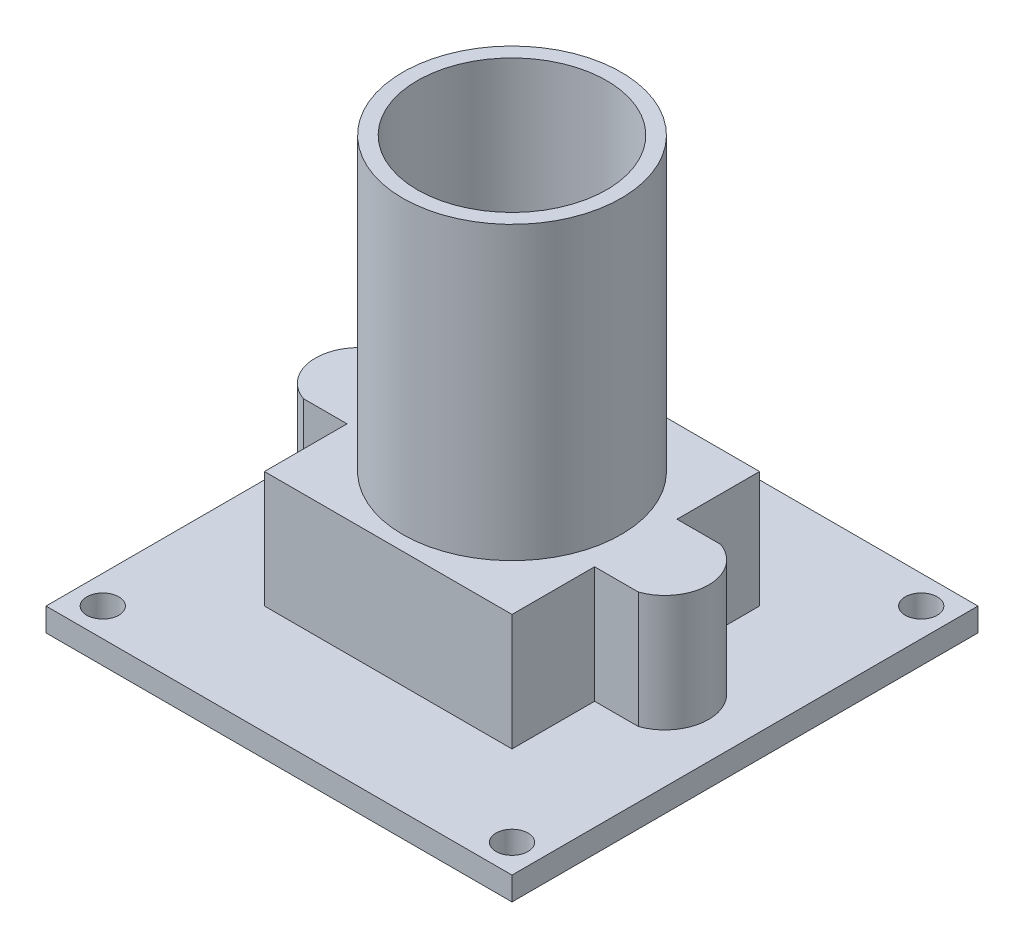
ISO-10303-21;
HEADER;
FILE_DESCRIPTION(('STEP AP214'),'2;1');
FILE_NAME('part.step','',(''),(''),'','','');
FILE_SCHEMA(('AUTOMOTIVE_DESIGN { 1 0 10303 214 1 1 1 1 }'));
ENDSEC;
DATA;
#1=APPLICATION_CONTEXT('core data for automotive mechanical design processes');
#2=APPLICATION_PROTOCOL_DEFINITION('international standard','automotive_design',2000,#1);
#3=PRODUCT_CONTEXT('',#1,'mechanical');
#4=PRODUCT('Part','Part','',(#3));
#5=PRODUCT_RELATED_PRODUCT_CATEGORY('part','',(#4));
#6=PRODUCT_DEFINITION_FORMATION('','',#4);
#7=PRODUCT_DEFINITION_CONTEXT('part definition',#1,'design');
#8=PRODUCT_DEFINITION('design','',#6,#7);
#9=PRODUCT_DEFINITION_SHAPE('','',#8);
#10=(LENGTH_UNIT() NAMED_UNIT(*) SI_UNIT(.MILLI.,.METRE.));
#11=(NAMED_UNIT(*) PLANE_ANGLE_UNIT() SI_UNIT($,.RADIAN.));
#12=(NAMED_UNIT(*) SI_UNIT($,.STERADIAN.) SOLID_ANGLE_UNIT());
#13=UNCERTAINTY_MEASURE_WITH_UNIT(LENGTH_MEASURE(1.E-05),#10,'distance_accuracy_value','');
#14=(GEOMETRIC_REPRESENTATION_CONTEXT(3) GLOBAL_UNCERTAINTY_ASSIGNED_CONTEXT((#13)) GLOBAL_UNIT_ASSIGNED_CONTEXT((#10,
#11,#12)) REPRESENTATION_CONTEXT('',''));
#15=CARTESIAN_POINT('',(0.,0.,0.));
#16=DIRECTION('',(0.,0.,1.));
#17=DIRECTION('',(1.,0.,0.));
#18=AXIS2_PLACEMENT_3D('',#15,#16,#17);
#19=CARTESIAN_POINT('',(0.,1.6,0.));
#20=DIRECTION('',(0.,-1.,0.));
#21=DIRECTION('',(0.,0.,-1.));
#22=AXIS2_PLACEMENT_3D('',#19,#20,#21);
#23=PLANE('',#22);
#24=CARTESIAN_POINT('',(-30.0499990738238,1.6,-1.95000092617623));
#25=DIRECTION('',(0.,1.,0.));
#26=DIRECTION('',(0.,0.,1.));
#27=AXIS2_PLACEMENT_3D('',#24,#25,#26);
#28=CIRCLE('',#27,1.1);
#29=CARTESIAN_POINT('',(-30.0499990738238,1.6,-0.850000926176233));
#30=VERTEX_POINT('',#29);
#31=EDGE_CURVE('E326',#30,#30,#28,.T.);
#32=ORIENTED_EDGE('',*,*,#31,.F.);
#33=EDGE_LOOP('',(#32));
#34=FACE_BOUND('',#33,.T.);
#35=CARTESIAN_POINT('',(-1.94999907382376,1.6,-1.94999907382376));
#36=DIRECTION('',(0.,1.,0.));
#37=DIRECTION('',(0.,0.,1.));
#38=AXIS2_PLACEMENT_3D('',#35,#36,#37);
#39=CIRCLE('',#38,1.1);
#40=CARTESIAN_POINT('',(-1.94999907382376,1.6,-0.849999073823763));
#41=VERTEX_POINT('',#40);
#42=EDGE_CURVE('E332',#41,#41,#39,.T.);
#43=ORIENTED_EDGE('',*,*,#42,.F.);
#44=EDGE_LOOP('',(#43));
#45=FACE_BOUND('',#44,.T.);
#46=CARTESIAN_POINT('',(-1.95000092617624,1.6,-30.0499990738238));
#47=DIRECTION('',(0.,1.,0.));
#48=DIRECTION('',(0.,0.,1.));
#49=AXIS2_PLACEMENT_3D('',#46,#47,#48);
#50=CIRCLE('',#49,1.1);
#51=CARTESIAN_POINT('',(-1.95000092617624,1.6,-28.9499990738238));
#52=VERTEX_POINT('',#51);
#53=EDGE_CURVE('E338',#52,#52,#50,.T.);
#54=ORIENTED_EDGE('',*,*,#53,.F.);
#55=EDGE_LOOP('',(#54));
#56=FACE_BOUND('',#55,.T.);
#57=CARTESIAN_POINT('',(-30.0500009261762,1.6,-30.0500009261762));
#58=DIRECTION('',(0.,1.,0.));
#59=DIRECTION('',(0.,0.,1.));
#60=AXIS2_PLACEMENT_3D('',#57,#58,#59);
#61=CIRCLE('',#60,1.1);
#62=CARTESIAN_POINT('',(-30.0500009261762,1.6,-28.9500009261762));
#63=VERTEX_POINT('',#62);
#64=EDGE_CURVE('E320',#63,#63,#61,.T.);
#65=ORIENTED_EDGE('',*,*,#64,.F.);
#66=EDGE_LOOP('',(#65));
#67=FACE_BOUND('',#66,.T.);
#68=DIRECTION('',(0.,0.,-1.));
#69=VECTOR('',#68,1.);
#70=CARTESIAN_POINT('',(0.,1.6,-32.));
#71=LINE('',#70,#69);
#72=CARTESIAN_POINT('',(0.,1.6,0.));
#73=VERTEX_POINT('',#72);
#74=CARTESIAN_POINT('',(0.,1.6,-32.));
#75=VERTEX_POINT('',#74);
#76=EDGE_CURVE('E210',#73,#75,#71,.T.);
#77=ORIENTED_EDGE('',*,*,#76,.T.);
#78=DIRECTION('',(-1.,0.,0.));
#79=VECTOR('',#78,1.);
#80=CARTESIAN_POINT('',(-32.,1.6,-32.));
#81=LINE('',#80,#79);
#82=CARTESIAN_POINT('',(-32.,1.6,-32.));
#83=VERTEX_POINT('',#82);
#84=EDGE_CURVE('E213',#75,#83,#81,.T.);
#85=ORIENTED_EDGE('',*,*,#84,.T.);
#86=DIRECTION('',(0.,0.,1.));
#87=VECTOR('',#86,1.);
#88=CARTESIAN_POINT('',(-32.,1.6,0.));
#89=LINE('',#88,#87);
#90=CARTESIAN_POINT('',(-32.,1.6,0.));
#91=VERTEX_POINT('',#90);
#92=EDGE_CURVE('E216',#83,#91,#89,.T.);
#93=ORIENTED_EDGE('',*,*,#92,.T.);
#94=DIRECTION('',(1.,0.,0.));
#95=VECTOR('',#94,1.);
#96=CARTESIAN_POINT('',(0.,1.6,0.));
#97=LINE('',#96,#95);
#98=EDGE_CURVE('E218',#91,#73,#97,.T.);
#99=ORIENTED_EDGE('',*,*,#98,.T.);
#100=EDGE_LOOP('',(#77,#85,#93,#99));
#101=FACE_BOUND('',#100,.T.);
#102=DIRECTION('',(1.,0.,0.));
#103=VECTOR('',#102,1.);
#104=CARTESIAN_POINT('',(-4.5,1.6,-13.1715728752538));
#105=LINE('',#104,#103);
#106=CARTESIAN_POINT('',(-7.5,1.6,-13.1715728752538));
#107=VERTEX_POINT('',#106);
#108=CARTESIAN_POINT('',(-4.5,1.6,-13.1715728752538));
#109=VERTEX_POINT('',#108);
#110=EDGE_CURVE('E260',#107,#109,#105,.T.);
#111=ORIENTED_EDGE('',*,*,#110,.F.);
#112=DIRECTION('',(0.,0.,-1.));
#113=VECTOR('',#112,1.);
#114=CARTESIAN_POINT('',(-7.5,1.6,-7.5));
#115=LINE('',#114,#113);
#116=CARTESIAN_POINT('',(-7.5,1.6,-7.5));
#117=VERTEX_POINT('',#116);
#118=EDGE_CURVE('E168',#117,#107,#115,.T.);
#119=ORIENTED_EDGE('',*,*,#118,.F.);
#120=DIRECTION('',(1.,0.,0.));
#121=VECTOR('',#120,1.);
#122=CARTESIAN_POINT('',(-24.5,1.6,-7.5));
#123=LINE('',#122,#121);
#124=CARTESIAN_POINT('',(-24.5,1.6,-7.5));
#125=VERTEX_POINT('',#124);
#126=EDGE_CURVE('E180',#125,#117,#123,.T.);
#127=ORIENTED_EDGE('',*,*,#126,.F.);
#128=DIRECTION('',(0.,0.,1.));
#129=VECTOR('',#128,1.);
#130=CARTESIAN_POINT('',(-24.5,1.6,-24.5));
#131=LINE('',#130,#129);
#132=CARTESIAN_POINT('',(-24.5,1.6,-13.1715728752538));
#133=VERTEX_POINT('',#132);
#134=EDGE_CURVE('E193',#133,#125,#131,.T.);
#135=ORIENTED_EDGE('',*,*,#134,.F.);
#136=DIRECTION('',(1.,0.,0.));
#137=VECTOR('',#136,1.);
#138=CARTESIAN_POINT('',(-27.5,1.6,-13.1715728752538));
#139=LINE('',#138,#137);
#140=CARTESIAN_POINT('',(-27.5,1.6,-13.1715728752538));
#141=VERTEX_POINT('',#140);
#142=EDGE_CURVE('E283',#141,#133,#139,.T.);
#143=ORIENTED_EDGE('',*,*,#142,.F.);
#144=CARTESIAN_POINT('',(-26.5,1.6,-16.));
#145=DIRECTION('',(0.,1.,0.));
#146=DIRECTION('',(0.,0.,1.));
#147=AXIS2_PLACEMENT_3D('',#144,#145,#146);
#148=CIRCLE('',#147,3.);
#149=CARTESIAN_POINT('',(-27.5,1.6,-18.8284271247462));
#150=VERTEX_POINT('',#149);
#151=EDGE_CURVE('E288',#150,#141,#148,.T.);
#152=ORIENTED_EDGE('',*,*,#151,.F.);
#153=DIRECTION('',(-1.,0.,0.));
#154=VECTOR('',#153,1.);
#155=CARTESIAN_POINT('',(-24.5,1.6,-18.8284271247462));
#156=LINE('',#155,#154);
#157=CARTESIAN_POINT('',(-24.5,1.6,-18.8284271247462));
#158=VERTEX_POINT('',#157);
#159=EDGE_CURVE('E169',#158,#150,#156,.T.);
#160=ORIENTED_EDGE('',*,*,#159,.F.);
#161=CARTESIAN_POINT('',(-24.5,1.6,-24.5));
#162=VERTEX_POINT('',#161);
#163=EDGE_CURVE('E194',#162,#158,#131,.T.);
#164=ORIENTED_EDGE('',*,*,#163,.F.);
#165=DIRECTION('',(-1.,0.,0.));
#166=VECTOR('',#165,1.);
#167=CARTESIAN_POINT('',(-7.5,1.6,-24.5));
#168=LINE('',#167,#166);
#169=CARTESIAN_POINT('',(-7.5,1.6,-24.5));
#170=VERTEX_POINT('',#169);
#171=EDGE_CURVE('E189',#170,#162,#168,.T.);
#172=ORIENTED_EDGE('',*,*,#171,.F.);
#173=CARTESIAN_POINT('',(-7.5,1.6,-18.8284271247462));
#174=VERTEX_POINT('',#173);
#175=EDGE_CURVE('E190',#174,#170,#115,.T.);
#176=ORIENTED_EDGE('',*,*,#175,.F.);
#177=DIRECTION('',(-1.,0.,0.));
#178=VECTOR('',#177,1.);
#179=CARTESIAN_POINT('',(-7.5,1.6,-18.8284271247462));
#180=LINE('',#179,#178);
#181=CARTESIAN_POINT('',(-4.5,1.6,-18.8284271247462));
#182=VERTEX_POINT('',#181);
#183=EDGE_CURVE('E160',#182,#174,#180,.T.);
#184=ORIENTED_EDGE('',*,*,#183,.F.);
#185=CARTESIAN_POINT('',(-5.49999999999999,1.6,-16.));
#186=DIRECTION('',(0.,1.,0.));
#187=DIRECTION('',(0.,0.,-1.));
#188=AXIS2_PLACEMENT_3D('',#185,#186,#187);
#189=CIRCLE('',#188,3.);
#190=EDGE_CURVE('E263',#109,#182,#189,.T.);
#191=ORIENTED_EDGE('',*,*,#190,.F.);
#192=EDGE_LOOP('',(#111,#119,#127,#135,#143,#152,#160,#164,#172,#176,#184,#191));
#193=FACE_BOUND('',#192,.T.);
#194=ADVANCED_FACE('F34',(#34,#45,#56,#67,#101,#193),#23,.F.);
#195=CARTESIAN_POINT('',(-7.5,9.6,-7.5));
#196=DIRECTION('',(-1.,0.,0.));
#197=DIRECTION('',(0.,0.,1.));
#198=AXIS2_PLACEMENT_3D('',#195,#196,#197);
#199=PLANE('',#198);
#200=DIRECTION('',(0.,-1.,0.));
#201=VECTOR('',#200,1.);
#202=CARTESIAN_POINT('',(-7.5,9.6,-13.1715728752538));
#203=LINE('',#202,#201);
#204=CARTESIAN_POINT('',(-7.5,9.6,-13.1715728752538));
#205=VERTEX_POINT('',#204);
#206=EDGE_CURVE('E152',#205,#107,#203,.T.);
#207=ORIENTED_EDGE('',*,*,#206,.F.);
#208=DIRECTION('',(0.,0.,-1.));
#209=VECTOR('',#208,1.);
#210=CARTESIAN_POINT('',(-7.5,9.6,-7.5));
#211=LINE('',#210,#209);
#212=CARTESIAN_POINT('',(-7.5,9.6,-7.5));
#213=VERTEX_POINT('',#212);
#214=EDGE_CURVE('E167',#213,#205,#211,.T.);
#215=ORIENTED_EDGE('',*,*,#214,.F.);
#216=DIRECTION('',(0.,-1.,0.));
#217=VECTOR('',#216,1.);
#218=CARTESIAN_POINT('',(-7.5,9.6,-7.5));
#219=LINE('',#218,#217);
#220=EDGE_CURVE('E187',#213,#117,#219,.T.);
#221=ORIENTED_EDGE('',*,*,#220,.T.);
#222=ORIENTED_EDGE('',*,*,#118,.T.);
#223=EDGE_LOOP('',(#207,#215,#221,#222));
#224=FACE_BOUND('',#223,.T.);
#225=ADVANCED_FACE('F165',(#224),#199,.F.);
#226=DIRECTION('',(0.,-1.,0.));
#227=VECTOR('',#226,1.);
#228=CARTESIAN_POINT('',(-7.5,9.6,-18.8284271247462));
#229=LINE('',#228,#227);
#230=CARTESIAN_POINT('',(-7.5,9.6,-18.8284271247462));
#231=VERTEX_POINT('',#230);
#232=EDGE_CURVE('E50',#231,#174,#229,.T.);
#233=ORIENTED_EDGE('',*,*,#232,.T.);
#234=ORIENTED_EDGE('',*,*,#175,.T.);
#235=DIRECTION('',(0.,-1.,0.));
#236=VECTOR('',#235,1.);
#237=CARTESIAN_POINT('',(-7.5,9.6,-24.5));
#238=LINE('',#237,#236);
#239=CARTESIAN_POINT('',(-7.5,9.6,-24.5));
#240=VERTEX_POINT('',#239);
#241=EDGE_CURVE('E206',#240,#170,#238,.T.);
#242=ORIENTED_EDGE('',*,*,#241,.F.);
#243=EDGE_CURVE('E176',#231,#240,#211,.T.);
#244=ORIENTED_EDGE('',*,*,#243,.F.);
#245=EDGE_LOOP('',(#233,#234,#242,#244));
#246=FACE_BOUND('',#245,.T.);
#247=ADVANCED_FACE('F307',(#246),#199,.F.);
#248=CARTESIAN_POINT('',(-24.5,9.6,-24.5));
#249=DIRECTION('',(1.,0.,0.));
#250=DIRECTION('',(0.,0.,-1.));
#251=AXIS2_PLACEMENT_3D('',#248,#249,#250);
#252=PLANE('',#251);
#253=DIRECTION('',(0.,-1.,0.));
#254=VECTOR('',#253,1.);
#255=CARTESIAN_POINT('',(-24.5,9.6,-18.8284271247462));
#256=LINE('',#255,#254);
#257=CARTESIAN_POINT('',(-24.5,9.6,-18.8284271247462));
#258=VERTEX_POINT('',#257);
#259=EDGE_CURVE('E298',#258,#158,#256,.T.);
#260=ORIENTED_EDGE('',*,*,#259,.F.);
#261=DIRECTION('',(0.,0.,1.));
#262=VECTOR('',#261,1.);
#263=CARTESIAN_POINT('',(-24.5,9.6,-24.5));
#264=LINE('',#263,#262);
#265=CARTESIAN_POINT('',(-24.5,9.6,-24.5));
#266=VERTEX_POINT('',#265);
#267=EDGE_CURVE('E183',#266,#258,#264,.T.);
#268=ORIENTED_EDGE('',*,*,#267,.F.);
#269=DIRECTION('',(0.,-1.,0.));
#270=VECTOR('',#269,1.);
#271=CARTESIAN_POINT('',(-24.5,9.6,-24.5));
#272=LINE('',#271,#270);
#273=EDGE_CURVE('E203',#266,#162,#272,.T.);
#274=ORIENTED_EDGE('',*,*,#273,.T.);
#275=ORIENTED_EDGE('',*,*,#163,.T.);
#276=EDGE_LOOP('',(#260,#268,#274,#275));
#277=FACE_BOUND('',#276,.T.);
#278=ADVANCED_FACE('F410',(#277),#252,.F.);
#279=DIRECTION('',(0.,-1.,0.));
#280=VECTOR('',#279,1.);
#281=CARTESIAN_POINT('',(-24.5,9.6,-13.1715728752538));
#282=LINE('',#281,#280);
#283=CARTESIAN_POINT('',(-24.5,9.6,-13.1715728752538));
#284=VERTEX_POINT('',#283);
#285=EDGE_CURVE('E58',#284,#133,#282,.T.);
#286=ORIENTED_EDGE('',*,*,#285,.T.);
#287=ORIENTED_EDGE('',*,*,#134,.T.);
#288=DIRECTION('',(0.,-1.,0.));
#289=VECTOR('',#288,1.);
#290=CARTESIAN_POINT('',(-24.5,9.6,-7.5));
#291=LINE('',#290,#289);
#292=CARTESIAN_POINT('',(-24.5,9.6,-7.5));
#293=VERTEX_POINT('',#292);
#294=EDGE_CURVE('E200',#293,#125,#291,.T.);
#295=ORIENTED_EDGE('',*,*,#294,.F.);
#296=EDGE_CURVE('E178',#284,#293,#264,.T.);
#297=ORIENTED_EDGE('',*,*,#296,.F.);
#298=EDGE_LOOP('',(#286,#287,#295,#297));
#299=FACE_BOUND('',#298,.T.);
#300=ADVANCED_FACE('F413',(#299),#252,.F.);
#301=CARTESIAN_POINT('',(0.,1.6,-32.));
#302=DIRECTION('',(-1.,0.,0.));
#303=DIRECTION('',(0.,0.,1.));
#304=AXIS2_PLACEMENT_3D('',#301,#302,#303);
#305=PLANE('',#304);
#306=DIRECTION('',(0.,0.,-1.));
#307=VECTOR('',#306,1.);
#308=CARTESIAN_POINT('',(0.,0.,-32.));
#309=LINE('',#308,#307);
#310=CARTESIAN_POINT('',(0.,0.,0.));
#311=VERTEX_POINT('',#310);
#312=CARTESIAN_POINT('',(0.,0.,-32.));
#313=VERTEX_POINT('',#312);
#314=EDGE_CURVE('E209',#311,#313,#309,.T.);
#315=ORIENTED_EDGE('',*,*,#314,.T.);
#316=DIRECTION('',(0.,-1.,0.));
#317=VECTOR('',#316,1.);
#318=CARTESIAN_POINT('',(0.,1.6,-32.));
#319=LINE('',#318,#317);
#320=EDGE_CURVE('E38',#75,#313,#319,.T.);
#321=ORIENTED_EDGE('',*,*,#320,.F.);
#322=ORIENTED_EDGE('',*,*,#76,.F.);
#323=DIRECTION('',(0.,-1.,0.));
#324=VECTOR('',#323,1.);
#325=CARTESIAN_POINT('',(0.,1.6,0.));
#326=LINE('',#325,#324);
#327=EDGE_CURVE('E220',#73,#311,#326,.T.);
#328=ORIENTED_EDGE('',*,*,#327,.T.);
#329=EDGE_LOOP('',(#315,#321,#322,#328));
#330=FACE_BOUND('',#329,.T.);
#331=ADVANCED_FACE('F36',(#330),#305,.F.);
#332=CARTESIAN_POINT('',(-32.,1.6,-32.));
#333=DIRECTION('',(0.,0.,1.));
#334=DIRECTION('',(1.,0.,0.));
#335=AXIS2_PLACEMENT_3D('',#332,#333,#334);
#336=PLANE('',#335);
#337=DIRECTION('',(-1.,0.,0.));
#338=VECTOR('',#337,1.);
#339=CARTESIAN_POINT('',(-32.,0.,-32.));
#340=LINE('',#339,#338);
#341=CARTESIAN_POINT('',(-32.,0.,-32.));
#342=VERTEX_POINT('',#341);
#343=EDGE_CURVE('E223',#313,#342,#340,.T.);
#344=ORIENTED_EDGE('',*,*,#343,.T.);
#345=DIRECTION('',(0.,-1.,0.));
#346=VECTOR('',#345,1.);
#347=CARTESIAN_POINT('',(-32.,1.6,-32.));
#348=LINE('',#347,#346);
#349=EDGE_CURVE('E232',#83,#342,#348,.T.);
#350=ORIENTED_EDGE('',*,*,#349,.F.);
#351=ORIENTED_EDGE('',*,*,#84,.F.);
#352=ORIENTED_EDGE('',*,*,#320,.T.);
#353=EDGE_LOOP('',(#344,#350,#351,#352));
#354=FACE_BOUND('',#353,.T.);
#355=ADVANCED_FACE('F241',(#354),#336,.F.);
#356=CARTESIAN_POINT('',(-32.,1.6,0.));
#357=DIRECTION('',(1.,0.,0.));
#358=DIRECTION('',(0.,0.,-1.));
#359=AXIS2_PLACEMENT_3D('',#356,#357,#358);
#360=PLANE('',#359);
#361=DIRECTION('',(0.,0.,1.));
#362=VECTOR('',#361,1.);
#363=CARTESIAN_POINT('',(-32.,0.,0.));
#364=LINE('',#363,#362);
#365=CARTESIAN_POINT('',(-32.,0.,0.));
#366=VERTEX_POINT('',#365);
#367=EDGE_CURVE('E225',#342,#366,#364,.T.);
#368=ORIENTED_EDGE('',*,*,#367,.T.);
#369=DIRECTION('',(0.,-1.,0.));
#370=VECTOR('',#369,1.);
#371=CARTESIAN_POINT('',(-32.,1.6,0.));
#372=LINE('',#371,#370);
#373=EDGE_CURVE('E230',#91,#366,#372,.T.);
#374=ORIENTED_EDGE('',*,*,#373,.F.);
#375=ORIENTED_EDGE('',*,*,#92,.F.);
#376=ORIENTED_EDGE('',*,*,#349,.T.);
#377=EDGE_LOOP('',(#368,#374,#375,#376));
#378=FACE_BOUND('',#377,.T.);
#379=ADVANCED_FACE('F250',(#378),#360,.F.);
#380=CARTESIAN_POINT('',(0.,1.6,0.));
#381=DIRECTION('',(0.,0.,-1.));
#382=DIRECTION('',(-1.,0.,0.));
#383=AXIS2_PLACEMENT_3D('',#380,#381,#382);
#384=PLANE('',#383);
#385=DIRECTION('',(1.,0.,0.));
#386=VECTOR('',#385,1.);
#387=CARTESIAN_POINT('',(0.,0.,0.));
#388=LINE('',#387,#386);
#389=EDGE_CURVE('E214',#366,#311,#388,.T.);
#390=ORIENTED_EDGE('',*,*,#389,.T.);
#391=ORIENTED_EDGE('',*,*,#327,.F.);
#392=ORIENTED_EDGE('',*,*,#98,.F.);
#393=ORIENTED_EDGE('',*,*,#373,.T.);
#394=EDGE_LOOP('',(#390,#391,#392,#393));
#395=FACE_BOUND('',#394,.T.);
#396=ADVANCED_FACE('F253',(#395),#384,.F.);
#397=CARTESIAN_POINT('',(0.,0.,0.));
#398=DIRECTION('',(0.,-1.,0.));
#399=DIRECTION('',(0.,0.,-1.));
#400=AXIS2_PLACEMENT_3D('',#397,#398,#399);
#401=PLANE('',#400);
#402=CARTESIAN_POINT('',(-30.0499990738238,0.,-1.95000092617623));
#403=DIRECTION('',(0.,1.,0.));
#404=DIRECTION('',(0.,0.,1.));
#405=AXIS2_PLACEMENT_3D('',#402,#403,#404);
#406=CIRCLE('',#405,1.1);
#407=CARTESIAN_POINT('',(-30.0499990738238,0.,-0.850000926176233));
#408=VERTEX_POINT('',#407);
#409=EDGE_CURVE('E329',#408,#408,#406,.T.);
#410=ORIENTED_EDGE('',*,*,#409,.T.);
#411=EDGE_LOOP('',(#410));
#412=FACE_BOUND('',#411,.T.);
#413=CARTESIAN_POINT('',(-1.94999907382376,0.,-1.94999907382376));
#414=DIRECTION('',(0.,1.,0.));
#415=DIRECTION('',(0.,0.,1.));
#416=AXIS2_PLACEMENT_3D('',#413,#414,#415);
#417=CIRCLE('',#416,1.1);
#418=CARTESIAN_POINT('',(-1.94999907382376,0.,-0.849999073823763));
#419=VERTEX_POINT('',#418);
#420=EDGE_CURVE('E335',#419,#419,#417,.T.);
#421=ORIENTED_EDGE('',*,*,#420,.T.);
#422=EDGE_LOOP('',(#421));
#423=FACE_BOUND('',#422,.T.);
#424=CARTESIAN_POINT('',(-1.95000092617624,0.,-30.0499990738238));
#425=DIRECTION('',(0.,1.,0.));
#426=DIRECTION('',(0.,0.,1.));
#427=AXIS2_PLACEMENT_3D('',#424,#425,#426);
#428=CIRCLE('',#427,1.1);
#429=CARTESIAN_POINT('',(-1.95000092617624,0.,-28.9499990738238));
#430=VERTEX_POINT('',#429);
#431=EDGE_CURVE('E323',#430,#430,#428,.T.);
#432=ORIENTED_EDGE('',*,*,#431,.T.);
#433=EDGE_LOOP('',(#432));
#434=FACE_BOUND('',#433,.T.);
#435=CARTESIAN_POINT('',(-30.0500009261762,0.,-30.0500009261762));
#436=DIRECTION('',(0.,1.,0.));
#437=DIRECTION('',(0.,0.,1.));
#438=AXIS2_PLACEMENT_3D('',#435,#436,#437);
#439=CIRCLE('',#438,1.1);
#440=CARTESIAN_POINT('',(-30.0500009261762,0.,-28.9500009261762));
#441=VERTEX_POINT('',#440);
#442=EDGE_CURVE('E318',#441,#441,#439,.T.);
#443=ORIENTED_EDGE('',*,*,#442,.T.);
#444=EDGE_LOOP('',(#443));
#445=FACE_BOUND('',#444,.T.);
#446=ORIENTED_EDGE('',*,*,#314,.F.);
#447=ORIENTED_EDGE('',*,*,#389,.F.);
#448=ORIENTED_EDGE('',*,*,#367,.F.);
#449=ORIENTED_EDGE('',*,*,#343,.F.);
#450=EDGE_LOOP('',(#446,#447,#448,#449));
#451=FACE_BOUND('',#450,.T.);
#452=ADVANCED_FACE('F248',(#412,#423,#434,#445,#451),#401,.T.);
#453=CARTESIAN_POINT('',(-7.5,9.6,-24.5));
#454=DIRECTION('',(0.,0.,1.));
#455=DIRECTION('',(1.,0.,0.));
#456=AXIS2_PLACEMENT_3D('',#453,#454,#455);
#457=PLANE('',#456);
#458=ORIENTED_EDGE('',*,*,#171,.T.);
#459=ORIENTED_EDGE('',*,*,#273,.F.);
#460=DIRECTION('',(-1.,0.,0.));
#461=VECTOR('',#460,1.);
#462=CARTESIAN_POINT('',(-7.5,9.6,-24.5));
#463=LINE('',#462,#461);
#464=EDGE_CURVE('E175',#240,#266,#463,.T.);
#465=ORIENTED_EDGE('',*,*,#464,.F.);
#466=ORIENTED_EDGE('',*,*,#241,.T.);
#467=EDGE_LOOP('',(#458,#459,#465,#466));
#468=FACE_BOUND('',#467,.T.);
#469=ADVANCED_FACE('F313',(#468),#457,.F.);
#470=CARTESIAN_POINT('',(-24.5,9.6,-7.5));
#471=DIRECTION('',(0.,0.,-1.));
#472=DIRECTION('',(-1.,0.,0.));
#473=AXIS2_PLACEMENT_3D('',#470,#471,#472);
#474=PLANE('',#473);
#475=ORIENTED_EDGE('',*,*,#126,.T.);
#476=ORIENTED_EDGE('',*,*,#220,.F.);
#477=DIRECTION('',(1.,0.,0.));
#478=VECTOR('',#477,1.);
#479=CARTESIAN_POINT('',(-24.5,9.6,-7.5));
#480=LINE('',#479,#478);
#481=EDGE_CURVE('E173',#293,#213,#480,.T.);
#482=ORIENTED_EDGE('',*,*,#481,.F.);
#483=ORIENTED_EDGE('',*,*,#294,.T.);
#484=EDGE_LOOP('',(#475,#476,#482,#483));
#485=FACE_BOUND('',#484,.T.);
#486=ADVANCED_FACE('F405',(#485),#474,.F.);
#487=CARTESIAN_POINT('',(0.,9.6,0.));
#488=DIRECTION('',(0.,1.,0.));
#489=DIRECTION('',(0.,0.,1.));
#490=AXIS2_PLACEMENT_3D('',#487,#488,#489);
#491=PLANE('',#490);
#492=CARTESIAN_POINT('',(-16.,9.6,-16.));
#493=DIRECTION('',(0.,1.,0.));
#494=DIRECTION('',(0.,0.,1.));
#495=AXIS2_PLACEMENT_3D('',#492,#493,#494);
#496=CIRCLE('',#495,7.5);
#497=CARTESIAN_POINT('',(-16.,9.6,-8.5));
#498=VERTEX_POINT('',#497);
#499=EDGE_CURVE('E11',#498,#498,#496,.T.);
#500=ORIENTED_EDGE('',*,*,#499,.F.);
#501=EDGE_LOOP('',(#500));
#502=FACE_BOUND('',#501,.T.);
#503=ORIENTED_EDGE('',*,*,#214,.T.);
#504=DIRECTION('',(1.,0.,0.));
#505=VECTOR('',#504,1.);
#506=CARTESIAN_POINT('',(-4.5,9.6,-13.1715728752538));
#507=LINE('',#506,#505);
#508=CARTESIAN_POINT('',(-4.5,9.6,-13.1715728752538));
#509=VERTEX_POINT('',#508);
#510=EDGE_CURVE('E149',#205,#509,#507,.T.);
#511=ORIENTED_EDGE('',*,*,#510,.T.);
#512=CARTESIAN_POINT('',(-5.49999999999999,9.6,-16.));
#513=DIRECTION('',(0.,1.,0.));
#514=DIRECTION('',(0.,0.,-1.));
#515=AXIS2_PLACEMENT_3D('',#512,#513,#514);
#516=CIRCLE('',#515,3.);
#517=CARTESIAN_POINT('',(-4.5,9.6,-18.8284271247462));
#518=VERTEX_POINT('',#517);
#519=EDGE_CURVE('E159',#509,#518,#516,.T.);
#520=ORIENTED_EDGE('',*,*,#519,.T.);
#521=DIRECTION('',(-1.,0.,0.));
#522=VECTOR('',#521,1.);
#523=CARTESIAN_POINT('',(-7.5,9.6,-18.8284271247462));
#524=LINE('',#523,#522);
#525=EDGE_CURVE('E271',#518,#231,#524,.T.);
#526=ORIENTED_EDGE('',*,*,#525,.T.);
#527=ORIENTED_EDGE('',*,*,#243,.T.);
#528=ORIENTED_EDGE('',*,*,#464,.T.);
#529=ORIENTED_EDGE('',*,*,#267,.T.);
#530=DIRECTION('',(-1.,0.,0.));
#531=VECTOR('',#530,1.);
#532=CARTESIAN_POINT('',(-24.5,9.6,-18.8284271247462));
#533=LINE('',#532,#531);
#534=CARTESIAN_POINT('',(-27.5,9.6,-18.8284271247462));
#535=VERTEX_POINT('',#534);
#536=EDGE_CURVE('E280',#258,#535,#533,.T.);
#537=ORIENTED_EDGE('',*,*,#536,.T.);
#538=CARTESIAN_POINT('',(-26.5,9.6,-16.));
#539=DIRECTION('',(0.,1.,0.));
#540=DIRECTION('',(0.,0.,1.));
#541=AXIS2_PLACEMENT_3D('',#538,#539,#540);
#542=CIRCLE('',#541,3.);
#543=CARTESIAN_POINT('',(-27.5,9.6,-13.1715728752538));
#544=VERTEX_POINT('',#543);
#545=EDGE_CURVE('E282',#535,#544,#542,.T.);
#546=ORIENTED_EDGE('',*,*,#545,.T.);
#547=DIRECTION('',(1.,0.,0.));
#548=VECTOR('',#547,1.);
#549=CARTESIAN_POINT('',(-27.5,9.6,-13.1715728752538));
#550=LINE('',#549,#548);
#551=EDGE_CURVE('E285',#544,#284,#550,.T.);
#552=ORIENTED_EDGE('',*,*,#551,.T.);
#553=ORIENTED_EDGE('',*,*,#296,.T.);
#554=ORIENTED_EDGE('',*,*,#481,.T.);
#555=EDGE_LOOP('',(#503,#511,#520,#526,#527,#528,#529,#537,#546,#552,#553,#554));
#556=FACE_BOUND('',#555,.T.);
#557=ADVANCED_FACE('F171',(#502,#556),#491,.T.);
#558=CARTESIAN_POINT('',(-16.,29.6,-16.));
#559=DIRECTION('',(0.,-1.,0.));
#560=DIRECTION('',(0.,0.,-1.));
#561=AXIS2_PLACEMENT_3D('',#558,#559,#560);
#562=CYLINDRICAL_SURFACE('',#561,7.5);
#563=CARTESIAN_POINT('',(-16.,29.6,-16.));
#564=DIRECTION('',(0.,1.,0.));
#565=DIRECTION('',(0.,0.,1.));
#566=AXIS2_PLACEMENT_3D('',#563,#564,#565);
#567=CIRCLE('',#566,7.5);
#568=CARTESIAN_POINT('',(-16.,29.6,-8.5));
#569=VERTEX_POINT('',#568);
#570=EDGE_CURVE('E299',#569,#569,#567,.T.);
#571=ORIENTED_EDGE('',*,*,#570,.F.);
#572=EDGE_LOOP('',(#571));
#573=FACE_BOUND('',#572,.T.);
#574=ORIENTED_EDGE('',*,*,#499,.T.);
#575=EDGE_LOOP('',(#574));
#576=FACE_BOUND('',#575,.T.);
#577=ADVANCED_FACE('F398',(#573,#576),#562,.T.);
#578=CARTESIAN_POINT('',(-16.,29.6,-16.));
#579=DIRECTION('',(0.,1.,0.));
#580=DIRECTION('',(0.,0.,1.));
#581=AXIS2_PLACEMENT_3D('',#578,#579,#580);
#582=PLANE('',#581);
#583=CARTESIAN_POINT('',(-16.,29.6,-16.));
#584=DIRECTION('',(0.,1.,0.));
#585=DIRECTION('',(0.,0.,1.));
#586=AXIS2_PLACEMENT_3D('',#583,#584,#585);
#587=CIRCLE('',#586,6.5);
#588=CARTESIAN_POINT('',(-16.,29.6,-9.5));
#589=VERTEX_POINT('',#588);
#590=EDGE_CURVE('E268',#589,#589,#587,.T.);
#591=ORIENTED_EDGE('',*,*,#590,.F.);
#592=EDGE_LOOP('',(#591));
#593=FACE_BOUND('',#592,.T.);
#594=ORIENTED_EDGE('',*,*,#570,.T.);
#595=EDGE_LOOP('',(#594));
#596=FACE_BOUND('',#595,.T.);
#597=ADVANCED_FACE('F394',(#593,#596),#582,.T.);
#598=CARTESIAN_POINT('',(-24.5,9.6,-18.8284271247462));
#599=DIRECTION('',(0.,0.,1.));
#600=DIRECTION('',(1.,0.,0.));
#601=AXIS2_PLACEMENT_3D('',#598,#599,#600);
#602=PLANE('',#601);
#603=ORIENTED_EDGE('',*,*,#159,.T.);
#604=DIRECTION('',(0.,-1.,0.));
#605=VECTOR('',#604,1.);
#606=CARTESIAN_POINT('',(-27.5,9.6,-18.8284271247462));
#607=LINE('',#606,#605);
#608=EDGE_CURVE('E295',#535,#150,#607,.T.);
#609=ORIENTED_EDGE('',*,*,#608,.F.);
#610=ORIENTED_EDGE('',*,*,#536,.F.);
#611=ORIENTED_EDGE('',*,*,#259,.T.);
#612=EDGE_LOOP('',(#603,#609,#610,#611));
#613=FACE_BOUND('',#612,.T.);
#614=ADVANCED_FACE('F390',(#613),#602,.F.);
#615=CARTESIAN_POINT('',(-26.5,9.6,-16.));
#616=DIRECTION('',(0.,-1.,0.));
#617=DIRECTION('',(0.,0.,-1.));
#618=AXIS2_PLACEMENT_3D('',#615,#616,#617);
#619=CYLINDRICAL_SURFACE('',#618,3.);
#620=ORIENTED_EDGE('',*,*,#151,.T.);
#621=DIRECTION('',(0.,-1.,0.));
#622=VECTOR('',#621,1.);
#623=CARTESIAN_POINT('',(-27.5,9.6,-13.1715728752538));
#624=LINE('',#623,#622);
#625=EDGE_CURVE('E292',#544,#141,#624,.T.);
#626=ORIENTED_EDGE('',*,*,#625,.F.);
#627=ORIENTED_EDGE('',*,*,#545,.F.);
#628=ORIENTED_EDGE('',*,*,#608,.T.);
#629=EDGE_LOOP('',(#620,#626,#627,#628));
#630=FACE_BOUND('',#629,.T.);
#631=ADVANCED_FACE('F387',(#630),#619,.T.);
#632=CARTESIAN_POINT('',(-27.5,9.6,-13.1715728752538));
#633=DIRECTION('',(0.,0.,-1.));
#634=DIRECTION('',(-1.,0.,0.));
#635=AXIS2_PLACEMENT_3D('',#632,#633,#634);
#636=PLANE('',#635);
#637=ORIENTED_EDGE('',*,*,#142,.T.);
#638=ORIENTED_EDGE('',*,*,#285,.F.);
#639=ORIENTED_EDGE('',*,*,#551,.F.);
#640=ORIENTED_EDGE('',*,*,#625,.T.);
#641=EDGE_LOOP('',(#637,#638,#639,#640));
#642=FACE_BOUND('',#641,.T.);
#643=ADVANCED_FACE('F384',(#642),#636,.F.);
#644=CARTESIAN_POINT('',(-4.5,9.6,-13.1715728752538));
#645=DIRECTION('',(0.,0.,-1.));
#646=DIRECTION('',(-1.,0.,0.));
#647=AXIS2_PLACEMENT_3D('',#644,#645,#646);
#648=PLANE('',#647);
#649=ORIENTED_EDGE('',*,*,#110,.T.);
#650=DIRECTION('',(0.,-1.,0.));
#651=VECTOR('',#650,1.);
#652=CARTESIAN_POINT('',(-4.5,9.6,-13.1715728752538));
#653=LINE('',#652,#651);
#654=EDGE_CURVE('E155',#509,#109,#653,.T.);
#655=ORIENTED_EDGE('',*,*,#654,.F.);
#656=ORIENTED_EDGE('',*,*,#510,.F.);
#657=ORIENTED_EDGE('',*,*,#206,.T.);
#658=EDGE_LOOP('',(#649,#655,#656,#657));
#659=FACE_BOUND('',#658,.T.);
#660=ADVANCED_FACE('F151',(#659),#648,.F.);
#661=CARTESIAN_POINT('',(-5.49999999999999,9.6,-16.));
#662=DIRECTION('',(0.,-1.,0.));
#663=DIRECTION('',(0.,0.,-1.));
#664=AXIS2_PLACEMENT_3D('',#661,#662,#663);
#665=CYLINDRICAL_SURFACE('',#664,3.);
#666=ORIENTED_EDGE('',*,*,#190,.T.);
#667=DIRECTION('',(0.,-1.,0.));
#668=VECTOR('',#667,1.);
#669=CARTESIAN_POINT('',(-4.5,9.6,-18.8284271247462));
#670=LINE('',#669,#668);
#671=EDGE_CURVE('E276',#518,#182,#670,.T.);
#672=ORIENTED_EDGE('',*,*,#671,.F.);
#673=ORIENTED_EDGE('',*,*,#519,.F.);
#674=ORIENTED_EDGE('',*,*,#654,.T.);
#675=EDGE_LOOP('',(#666,#672,#673,#674));
#676=FACE_BOUND('',#675,.T.);
#677=ADVANCED_FACE('F378',(#676),#665,.T.);
#678=CARTESIAN_POINT('',(-7.5,9.6,-18.8284271247462));
#679=DIRECTION('',(0.,0.,1.));
#680=DIRECTION('',(1.,0.,0.));
#681=AXIS2_PLACEMENT_3D('',#678,#679,#680);
#682=PLANE('',#681);
#683=ORIENTED_EDGE('',*,*,#183,.T.);
#684=ORIENTED_EDGE('',*,*,#232,.F.);
#685=ORIENTED_EDGE('',*,*,#525,.F.);
#686=ORIENTED_EDGE('',*,*,#671,.T.);
#687=EDGE_LOOP('',(#683,#684,#685,#686));
#688=FACE_BOUND('',#687,.T.);
#689=ADVANCED_FACE('F374',(#688),#682,.F.);
#690=CARTESIAN_POINT('',(-16.,1.59999999999998,-16.));
#691=DIRECTION('',(0.,1.,0.));
#692=DIRECTION('',(0.,0.,1.));
#693=AXIS2_PLACEMENT_3D('',#690,#691,#692);
#694=CYLINDRICAL_SURFACE('',#693,6.5);
#695=CARTESIAN_POINT('',(-16.,1.59999999999998,-16.));
#696=DIRECTION('',(0.,1.,0.));
#697=DIRECTION('',(0.,0.,1.));
#698=AXIS2_PLACEMENT_3D('',#695,#696,#697);
#699=CIRCLE('',#698,6.5);
#700=CARTESIAN_POINT('',(-16.,1.59999999999998,-9.5));
#701=VERTEX_POINT('',#700);
#702=EDGE_CURVE('E264',#701,#701,#699,.T.);
#703=ORIENTED_EDGE('',*,*,#702,.F.);
#704=EDGE_LOOP('',(#703));
#705=FACE_BOUND('',#704,.T.);
#706=ORIENTED_EDGE('',*,*,#590,.T.);
#707=EDGE_LOOP('',(#706));
#708=FACE_BOUND('',#707,.T.);
#709=ADVANCED_FACE('F364',(#705,#708),#694,.F.);
#710=CARTESIAN_POINT('',(-16.,1.59999999999998,-16.));
#711=DIRECTION('',(0.,1.,0.));
#712=DIRECTION('',(0.,0.,1.));
#713=AXIS2_PLACEMENT_3D('',#710,#711,#712);
#714=PLANE('',#713);
#715=ORIENTED_EDGE('',*,*,#702,.T.);
#716=EDGE_LOOP('',(#715));
#717=FACE_BOUND('',#716,.T.);
#718=ADVANCED_FACE('F358',(#717),#714,.T.);
#719=CARTESIAN_POINT('',(-30.0500009261762,0.,-30.0500009261762));
#720=DIRECTION('',(0.,1.,0.));
#721=DIRECTION('',(0.,0.,1.));
#722=AXIS2_PLACEMENT_3D('',#719,#720,#721);
#723=CYLINDRICAL_SURFACE('',#722,1.1);
#724=ORIENTED_EDGE('',*,*,#442,.F.);
#725=EDGE_LOOP('',(#724));
#726=FACE_BOUND('',#725,.T.);
#727=ORIENTED_EDGE('',*,*,#64,.T.);
#728=EDGE_LOOP('',(#727));
#729=FACE_BOUND('',#728,.T.);
#730=ADVANCED_FACE('F350',(#726,#729),#723,.F.);
#731=CARTESIAN_POINT('',(-1.95000092617624,0.,-30.0499990738238));
#732=DIRECTION('',(0.,1.,0.));
#733=DIRECTION('',(0.,0.,1.));
#734=AXIS2_PLACEMENT_3D('',#731,#732,#733);
#735=CYLINDRICAL_SURFACE('',#734,1.1);
#736=ORIENTED_EDGE('',*,*,#431,.F.);
#737=EDGE_LOOP('',(#736));
#738=FACE_BOUND('',#737,.T.);
#739=ORIENTED_EDGE('',*,*,#53,.T.);
#740=EDGE_LOOP('',(#739));
#741=FACE_BOUND('',#740,.T.);
#742=ADVANCED_FACE('F346',(#738,#741),#735,.F.);
#743=CARTESIAN_POINT('',(-1.94999907382376,0.,-1.94999907382376));
#744=DIRECTION('',(0.,1.,0.));
#745=DIRECTION('',(0.,0.,1.));
#746=AXIS2_PLACEMENT_3D('',#743,#744,#745);
#747=CYLINDRICAL_SURFACE('',#746,1.1);
#748=ORIENTED_EDGE('',*,*,#420,.F.);
#749=EDGE_LOOP('',(#748));
#750=FACE_BOUND('',#749,.T.);
#751=ORIENTED_EDGE('',*,*,#42,.T.);
#752=EDGE_LOOP('',(#751));
#753=FACE_BOUND('',#752,.T.);
#754=ADVANCED_FACE('F349',(#750,#753),#747,.F.);
#755=CARTESIAN_POINT('',(-30.0499990738238,0.,-1.95000092617623));
#756=DIRECTION('',(0.,1.,0.));
#757=DIRECTION('',(0.,0.,1.));
#758=AXIS2_PLACEMENT_3D('',#755,#756,#757);
#759=CYLINDRICAL_SURFACE('',#758,1.1);
#760=ORIENTED_EDGE('',*,*,#409,.F.);
#761=EDGE_LOOP('',(#760));
#762=FACE_BOUND('',#761,.T.);
#763=ORIENTED_EDGE('',*,*,#31,.T.);
#764=EDGE_LOOP('',(#763));
#765=FACE_BOUND('',#764,.T.);
#766=ADVANCED_FACE('F369',(#762,#765),#759,.F.);
#767=CLOSED_SHELL('',(#194,#225,#247,#278,#300,#331,#355,#379,#396,#452,#469,#486,#557,#577,
#597,#614,#631,#643,#660,#677,#689,#709,#718,#730,#742,#754,#766));
#768=MANIFOLD_SOLID_BREP('B2',#767);
#769=ADVANCED_BREP_SHAPE_REPRESENTATION('',(#18,#768),#14);
#770=SHAPE_DEFINITION_REPRESENTATION(#9,#769);
ENDSEC;
END-ISO-10303-21;
